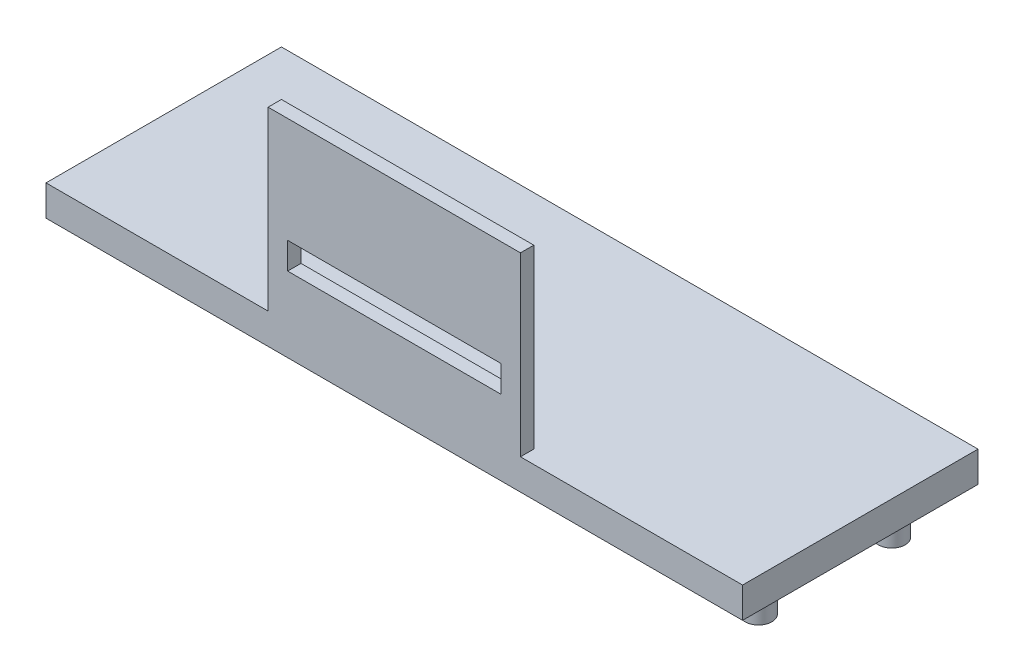
ISO-10303-21;
HEADER;
FILE_DESCRIPTION(('STEP AP214'),'2;1');
FILE_NAME('part.step','',(''),(''),'','','');
FILE_SCHEMA(('AUTOMOTIVE_DESIGN { 1 0 10303 214 1 1 1 1 }'));
ENDSEC;
DATA;
#1=APPLICATION_CONTEXT('core data for automotive mechanical design processes');
#2=APPLICATION_PROTOCOL_DEFINITION('international standard','automotive_design',2000,#1);
#3=PRODUCT_CONTEXT('',#1,'mechanical');
#4=PRODUCT('Part','Part','',(#3));
#5=PRODUCT_RELATED_PRODUCT_CATEGORY('part','',(#4));
#6=PRODUCT_DEFINITION_FORMATION('','',#4);
#7=PRODUCT_DEFINITION_CONTEXT('part definition',#1,'design');
#8=PRODUCT_DEFINITION('design','',#6,#7);
#9=PRODUCT_DEFINITION_SHAPE('','',#8);
#10=(LENGTH_UNIT() NAMED_UNIT(*) SI_UNIT(.MILLI.,.METRE.));
#11=(NAMED_UNIT(*) PLANE_ANGLE_UNIT() SI_UNIT($,.RADIAN.));
#12=(NAMED_UNIT(*) SI_UNIT($,.STERADIAN.) SOLID_ANGLE_UNIT());
#13=UNCERTAINTY_MEASURE_WITH_UNIT(LENGTH_MEASURE(1.E-05),#10,'distance_accuracy_value','');
#14=(GEOMETRIC_REPRESENTATION_CONTEXT(3) GLOBAL_UNCERTAINTY_ASSIGNED_CONTEXT((#13)) GLOBAL_UNIT_ASSIGNED_CONTEXT((#10,
#11,#12)) REPRESENTATION_CONTEXT('',''));
#15=CARTESIAN_POINT('',(0.,0.,0.));
#16=DIRECTION('',(0.,0.,1.));
#17=DIRECTION('',(1.,0.,0.));
#18=AXIS2_PLACEMENT_3D('',#15,#16,#17);
#19=CARTESIAN_POINT('',(0.,0.,0.));
#20=DIRECTION('',(0.,0.,1.));
#21=DIRECTION('',(1.,0.,0.));
#22=AXIS2_PLACEMENT_3D('',#19,#20,#21);
#23=PLANE('',#22);
#24=DIRECTION('',(0.,-1.,0.));
#25=VECTOR('',#24,1.);
#26=CARTESIAN_POINT('',(-30.0255264574549,-8.7836717439894,0.));
#27=LINE('',#26,#25);
#28=CARTESIAN_POINT('',(-30.0255264574549,-8.7836717439894,0.));
#29=VERTEX_POINT('',#28);
#30=CARTESIAN_POINT('',(-30.0255264574549,-14.7836717439894,0.));
#31=VERTEX_POINT('',#30);
#32=EDGE_CURVE('E200',#29,#31,#27,.T.);
#33=ORIENTED_EDGE('',*,*,#32,.F.);
#34=DIRECTION('',(-1.,0.,0.));
#35=VECTOR('',#34,1.);
#36=CARTESIAN_POINT('',(-30.0255264574549,-8.7836717439894,0.));
#37=LINE('',#36,#35);
#38=CARTESIAN_POINT('',(17.9744735425451,-8.7836717439894,0.));
#39=VERTEX_POINT('',#38);
#40=EDGE_CURVE('E213',#39,#29,#37,.T.);
#41=ORIENTED_EDGE('',*,*,#40,.F.);
#42=DIRECTION('',(0.,1.,0.));
#43=VECTOR('',#42,1.);
#44=CARTESIAN_POINT('',(17.9744735425451,-8.7836717439894,0.));
#45=LINE('',#44,#43);
#46=CARTESIAN_POINT('',(17.9744735425451,-14.7836717439894,0.));
#47=VERTEX_POINT('',#46);
#48=EDGE_CURVE('E209',#47,#39,#45,.T.);
#49=ORIENTED_EDGE('',*,*,#48,.F.);
#50=DIRECTION('',(1.,0.,0.));
#51=VECTOR('',#50,1.);
#52=CARTESIAN_POINT('',(-30.0255264574549,-14.7836717439894,0.));
#53=LINE('',#52,#51);
#54=EDGE_CURVE('E205',#31,#47,#53,.T.);
#55=ORIENTED_EDGE('',*,*,#54,.F.);
#56=EDGE_LOOP('',(#33,#41,#49,#55));
#57=FACE_BOUND('',#56,.T.);
#58=DIRECTION('',(0.,1.,0.));
#59=VECTOR('',#58,1.);
#60=CARTESIAN_POINT('',(-84.4294808914688,-31.6728949352056,0.));
#61=LINE('',#60,#59);
#62=CARTESIAN_POINT('',(-84.4294808914688,-31.6728949352056,0.));
#63=VERTEX_POINT('',#62);
#64=CARTESIAN_POINT('',(-84.4294808914688,-24.7836717439894,0.));
#65=VERTEX_POINT('',#64);
#66=EDGE_CURVE('E161',#63,#65,#61,.T.);
#67=ORIENTED_EDGE('',*,*,#66,.F.);
#68=DIRECTION('',(-1.,0.,0.));
#69=VECTOR('',#68,1.);
#70=CARTESIAN_POINT('',(72.3784279765591,-31.6728949352056,0.));
#71=LINE('',#70,#69);
#72=CARTESIAN_POINT('',(72.3784279765591,-31.6728949352056,0.));
#73=VERTEX_POINT('',#72);
#74=EDGE_CURVE('E157',#73,#63,#71,.T.);
#75=ORIENTED_EDGE('',*,*,#74,.F.);
#76=DIRECTION('',(0.,-1.,0.));
#77=VECTOR('',#76,1.);
#78=CARTESIAN_POINT('',(72.3784279765591,-24.7836717439894,0.));
#79=LINE('',#78,#77);
#80=CARTESIAN_POINT('',(72.3784279765591,-24.7836717439894,0.));
#81=VERTEX_POINT('',#80);
#82=EDGE_CURVE('E187',#81,#73,#79,.T.);
#83=ORIENTED_EDGE('',*,*,#82,.F.);
#84=DIRECTION('',(-1.,0.,0.));
#85=VECTOR('',#84,1.);
#86=CARTESIAN_POINT('',(72.3784279765591,-24.7836717439894,0.));
#87=LINE('',#86,#85);
#88=CARTESIAN_POINT('',(22.3784279765591,-24.7836717439894,0.));
#89=VERTEX_POINT('',#88);
#90=EDGE_CURVE('E195',#81,#89,#87,.T.);
#91=ORIENTED_EDGE('',*,*,#90,.T.);
#92=DIRECTION('',(0.,-1.,0.));
#93=VECTOR('',#92,1.);
#94=CARTESIAN_POINT('',(22.3784279765591,14.9757738157678,0.));
#95=LINE('',#94,#93);
#96=CARTESIAN_POINT('',(22.3784279765591,14.9757738157678,0.));
#97=VERTEX_POINT('',#96);
#98=EDGE_CURVE('E261',#97,#89,#95,.T.);
#99=ORIENTED_EDGE('',*,*,#98,.F.);
#100=DIRECTION('',(1.,0.,0.));
#101=VECTOR('',#100,1.);
#102=CARTESIAN_POINT('',(-34.4294808914688,14.9757738157678,0.));
#103=LINE('',#102,#101);
#104=CARTESIAN_POINT('',(-34.4294808914688,14.9757738157678,0.));
#105=VERTEX_POINT('',#104);
#106=EDGE_CURVE('E252',#105,#97,#103,.T.);
#107=ORIENTED_EDGE('',*,*,#106,.F.);
#108=DIRECTION('',(0.,-1.,0.));
#109=VECTOR('',#108,1.);
#110=CARTESIAN_POINT('',(-34.4294808914688,14.9757738157678,0.));
#111=LINE('',#110,#109);
#112=CARTESIAN_POINT('',(-34.4294808914688,-24.7836717439894,0.));
#113=VERTEX_POINT('',#112);
#114=EDGE_CURVE('E246',#105,#113,#111,.T.);
#115=ORIENTED_EDGE('',*,*,#114,.T.);
#116=DIRECTION('',(1.,0.,0.));
#117=VECTOR('',#116,1.);
#118=CARTESIAN_POINT('',(-84.4294808914688,-24.7836717439894,0.));
#119=LINE('',#118,#117);
#120=EDGE_CURVE('E63',#65,#113,#119,.T.);
#121=ORIENTED_EDGE('',*,*,#120,.F.);
#122=EDGE_LOOP('',(#67,#75,#83,#91,#99,#107,#115,#121));
#123=FACE_BOUND('',#122,.T.);
#124=ADVANCED_FACE('F45',(#57,#123),#23,.T.);
#125=CARTESIAN_POINT('',(-34.4294808914688,14.9757738157678,-3.));
#126=DIRECTION('',(-1.,0.,0.));
#127=DIRECTION('',(0.,0.,1.));
#128=AXIS2_PLACEMENT_3D('',#125,#126,#127);
#129=PLANE('',#128);
#130=DIRECTION('',(0.,0.,-1.));
#131=VECTOR('',#130,1.);
#132=CARTESIAN_POINT('',(-34.4294808914688,-24.7836717439894,-53.));
#133=LINE('',#132,#131);
#134=CARTESIAN_POINT('',(-34.4294808914688,-24.7836717439894,-3.));
#135=VERTEX_POINT('',#134);
#136=EDGE_CURVE('E167',#113,#135,#133,.T.);
#137=ORIENTED_EDGE('',*,*,#136,.F.);
#138=ORIENTED_EDGE('',*,*,#114,.F.);
#139=DIRECTION('',(0.,0.,1.));
#140=VECTOR('',#139,1.);
#141=CARTESIAN_POINT('',(-34.4294808914688,14.9757738157678,-3.));
#142=LINE('',#141,#140);
#143=CARTESIAN_POINT('',(-34.4294808914688,14.9757738157678,-3.));
#144=VERTEX_POINT('',#143);
#145=EDGE_CURVE('E55',#144,#105,#142,.T.);
#146=ORIENTED_EDGE('',*,*,#145,.F.);
#147=DIRECTION('',(0.,-1.,0.));
#148=VECTOR('',#147,1.);
#149=CARTESIAN_POINT('',(-34.4294808914688,14.9757738157678,-3.));
#150=LINE('',#149,#148);
#151=EDGE_CURVE('E247',#144,#135,#150,.T.);
#152=ORIENTED_EDGE('',*,*,#151,.T.);
#153=EDGE_LOOP('',(#137,#138,#146,#152));
#154=FACE_BOUND('',#153,.T.);
#155=ADVANCED_FACE('F47',(#154),#129,.T.);
#156=CARTESIAN_POINT('',(22.3784279765591,14.9757738157678,-3.));
#157=DIRECTION('',(-1.,0.,0.));
#158=DIRECTION('',(0.,0.,1.));
#159=AXIS2_PLACEMENT_3D('',#156,#157,#158);
#160=PLANE('',#159);
#161=DIRECTION('',(0.,0.,1.));
#162=VECTOR('',#161,1.);
#163=CARTESIAN_POINT('',(22.3784279765591,-24.7836717439894,-53.));
#164=LINE('',#163,#162);
#165=CARTESIAN_POINT('',(22.3784279765591,-24.7836717439894,-3.));
#166=VERTEX_POINT('',#165);
#167=EDGE_CURVE('E11',#166,#89,#164,.T.);
#168=ORIENTED_EDGE('',*,*,#167,.F.);
#169=DIRECTION('',(0.,-1.,0.));
#170=VECTOR('',#169,1.);
#171=CARTESIAN_POINT('',(22.3784279765591,14.9757738157678,-3.));
#172=LINE('',#171,#170);
#173=CARTESIAN_POINT('',(22.3784279765591,14.9757738157678,-3.));
#174=VERTEX_POINT('',#173);
#175=EDGE_CURVE('E251',#174,#166,#172,.T.);
#176=ORIENTED_EDGE('',*,*,#175,.F.);
#177=DIRECTION('',(0.,0.,1.));
#178=VECTOR('',#177,1.);
#179=CARTESIAN_POINT('',(22.3784279765591,14.9757738157678,-3.));
#180=LINE('',#179,#178);
#181=EDGE_CURVE('E49',#174,#97,#180,.T.);
#182=ORIENTED_EDGE('',*,*,#181,.T.);
#183=ORIENTED_EDGE('',*,*,#98,.T.);
#184=EDGE_LOOP('',(#168,#176,#182,#183));
#185=FACE_BOUND('',#184,.T.);
#186=ADVANCED_FACE('F273',(#185),#160,.F.);
#187=CARTESIAN_POINT('',(-34.4294808914688,14.9757738157678,-3.));
#188=DIRECTION('',(0.,-1.,0.));
#189=DIRECTION('',(0.,0.,-1.));
#190=AXIS2_PLACEMENT_3D('',#187,#188,#189);
#191=PLANE('',#190);
#192=ORIENTED_EDGE('',*,*,#106,.T.);
#193=ORIENTED_EDGE('',*,*,#181,.F.);
#194=DIRECTION('',(1.,0.,0.));
#195=VECTOR('',#194,1.);
#196=CARTESIAN_POINT('',(-34.4294808914688,14.9757738157678,-3.));
#197=LINE('',#196,#195);
#198=EDGE_CURVE('E255',#144,#174,#197,.T.);
#199=ORIENTED_EDGE('',*,*,#198,.F.);
#200=ORIENTED_EDGE('',*,*,#145,.T.);
#201=EDGE_LOOP('',(#192,#193,#199,#200));
#202=FACE_BOUND('',#201,.T.);
#203=ADVANCED_FACE('F285',(#202),#191,.F.);
#204=CARTESIAN_POINT('',(0.,0.,-3.));
#205=DIRECTION('',(0.,0.,1.));
#206=DIRECTION('',(1.,0.,0.));
#207=AXIS2_PLACEMENT_3D('',#204,#205,#206);
#208=PLANE('',#207);
#209=DIRECTION('',(-1.,0.,0.));
#210=VECTOR('',#209,1.);
#211=CARTESIAN_POINT('',(0.,-8.7836717439894,-3.));
#212=LINE('',#211,#210);
#213=CARTESIAN_POINT('',(17.9744735425451,-8.7836717439894,-3.));
#214=VERTEX_POINT('',#213);
#215=CARTESIAN_POINT('',(-30.0255264574549,-8.7836717439894,-3.));
#216=VERTEX_POINT('',#215);
#217=EDGE_CURVE('E238',#214,#216,#212,.T.);
#218=ORIENTED_EDGE('',*,*,#217,.T.);
#219=DIRECTION('',(0.,-1.,0.));
#220=VECTOR('',#219,1.);
#221=CARTESIAN_POINT('',(-30.0255264574549,0.,-3.));
#222=LINE('',#221,#220);
#223=CARTESIAN_POINT('',(-30.0255264574549,-14.7836717439894,-3.));
#224=VERTEX_POINT('',#223);
#225=EDGE_CURVE('E242',#216,#224,#222,.T.);
#226=ORIENTED_EDGE('',*,*,#225,.T.);
#227=DIRECTION('',(1.,0.,0.));
#228=VECTOR('',#227,1.);
#229=CARTESIAN_POINT('',(0.,-14.7836717439894,-3.));
#230=LINE('',#229,#228);
#231=CARTESIAN_POINT('',(17.9744735425451,-14.7836717439894,-3.));
#232=VERTEX_POINT('',#231);
#233=EDGE_CURVE('E221',#224,#232,#230,.T.);
#234=ORIENTED_EDGE('',*,*,#233,.T.);
#235=DIRECTION('',(0.,1.,0.));
#236=VECTOR('',#235,1.);
#237=CARTESIAN_POINT('',(17.9744735425451,0.,-3.));
#238=LINE('',#237,#236);
#239=EDGE_CURVE('E234',#232,#214,#238,.T.);
#240=ORIENTED_EDGE('',*,*,#239,.T.);
#241=EDGE_LOOP('',(#218,#226,#234,#240));
#242=FACE_BOUND('',#241,.T.);
#243=ORIENTED_EDGE('',*,*,#175,.T.);
#244=DIRECTION('',(-1.,0.,0.));
#245=VECTOR('',#244,1.);
#246=CARTESIAN_POINT('',(0.,-24.7836717439894,-3.));
#247=LINE('',#246,#245);
#248=EDGE_CURVE('E151',#166,#135,#247,.T.);
#249=ORIENTED_EDGE('',*,*,#248,.T.);
#250=ORIENTED_EDGE('',*,*,#151,.F.);
#251=ORIENTED_EDGE('',*,*,#198,.T.);
#252=EDGE_LOOP('',(#243,#249,#250,#251));
#253=FACE_BOUND('',#252,.T.);
#254=ADVANCED_FACE('F283',(#242,#253),#208,.F.);
#255=CARTESIAN_POINT('',(-30.0255264574549,-8.7836717439894,-10.));
#256=DIRECTION('',(-1.,0.,0.));
#257=DIRECTION('',(0.,-1.,0.));
#258=AXIS2_PLACEMENT_3D('',#255,#256,#257);
#259=PLANE('',#258);
#260=DIRECTION('',(0.,0.,1.));
#261=VECTOR('',#260,1.);
#262=CARTESIAN_POINT('',(-30.0255264574549,-8.7836717439894,-10.));
#263=LINE('',#262,#261);
#264=EDGE_CURVE('E218',#216,#29,#263,.T.);
#265=ORIENTED_EDGE('',*,*,#264,.T.);
#266=ORIENTED_EDGE('',*,*,#32,.T.);
#267=DIRECTION('',(0.,0.,1.));
#268=VECTOR('',#267,1.);
#269=CARTESIAN_POINT('',(-30.0255264574549,-14.7836717439894,-10.));
#270=LINE('',#269,#268);
#271=EDGE_CURVE('E217',#224,#31,#270,.T.);
#272=ORIENTED_EDGE('',*,*,#271,.F.);
#273=ORIENTED_EDGE('',*,*,#225,.F.);
#274=EDGE_LOOP('',(#265,#266,#272,#273));
#275=FACE_BOUND('',#274,.T.);
#276=ADVANCED_FACE('F292',(#275),#259,.F.);
#277=CARTESIAN_POINT('',(-30.0255264574549,-8.7836717439894,-10.));
#278=DIRECTION('',(0.,1.,0.));
#279=DIRECTION('',(0.,0.,1.));
#280=AXIS2_PLACEMENT_3D('',#277,#278,#279);
#281=PLANE('',#280);
#282=DIRECTION('',(0.,0.,1.));
#283=VECTOR('',#282,1.);
#284=CARTESIAN_POINT('',(17.9744735425451,-8.7836717439894,-10.));
#285=LINE('',#284,#283);
#286=EDGE_CURVE('E222',#214,#39,#285,.T.);
#287=ORIENTED_EDGE('',*,*,#286,.T.);
#288=ORIENTED_EDGE('',*,*,#40,.T.);
#289=ORIENTED_EDGE('',*,*,#264,.F.);
#290=ORIENTED_EDGE('',*,*,#217,.F.);
#291=EDGE_LOOP('',(#287,#288,#289,#290));
#292=FACE_BOUND('',#291,.T.);
#293=ADVANCED_FACE('F305',(#292),#281,.F.);
#294=CARTESIAN_POINT('',(17.9744735425451,-8.7836717439894,-10.));
#295=DIRECTION('',(1.,0.,0.));
#296=DIRECTION('',(0.,1.,0.));
#297=AXIS2_PLACEMENT_3D('',#294,#295,#296);
#298=PLANE('',#297);
#299=DIRECTION('',(0.,0.,1.));
#300=VECTOR('',#299,1.);
#301=CARTESIAN_POINT('',(17.9744735425451,-14.7836717439894,-10.));
#302=LINE('',#301,#300);
#303=EDGE_CURVE('E225',#232,#47,#302,.T.);
#304=ORIENTED_EDGE('',*,*,#303,.T.);
#305=ORIENTED_EDGE('',*,*,#48,.T.);
#306=ORIENTED_EDGE('',*,*,#286,.F.);
#307=ORIENTED_EDGE('',*,*,#239,.F.);
#308=EDGE_LOOP('',(#304,#305,#306,#307));
#309=FACE_BOUND('',#308,.T.);
#310=ADVANCED_FACE('F310',(#309),#298,.F.);
#311=CARTESIAN_POINT('',(-30.0255264574549,-14.7836717439894,-10.));
#312=DIRECTION('',(0.,-1.,0.));
#313=DIRECTION('',(0.,0.,-1.));
#314=AXIS2_PLACEMENT_3D('',#311,#312,#313);
#315=PLANE('',#314);
#316=ORIENTED_EDGE('',*,*,#271,.T.);
#317=ORIENTED_EDGE('',*,*,#54,.T.);
#318=ORIENTED_EDGE('',*,*,#303,.F.);
#319=ORIENTED_EDGE('',*,*,#233,.F.);
#320=EDGE_LOOP('',(#316,#317,#318,#319));
#321=FACE_BOUND('',#320,.T.);
#322=ADVANCED_FACE('F307',(#321),#315,.F.);
#323=CARTESIAN_POINT('',(0.,-31.6728949352056,-53.));
#324=DIRECTION('',(0.,1.,0.));
#325=DIRECTION('',(0.,0.,1.));
#326=AXIS2_PLACEMENT_3D('',#323,#324,#325);
#327=PLANE('',#326);
#328=CARTESIAN_POINT('',(62.9744735425451,-31.6728949352056,-43.));
#329=DIRECTION('',(0.,1.,0.));
#330=DIRECTION('',(0.,0.,1.));
#331=AXIS2_PLACEMENT_3D('',#328,#329,#330);
#332=CIRCLE('',#331,3.00000000000001);
#333=CARTESIAN_POINT('',(62.9744735425451,-31.6728949352056,-40.));
#334=VERTEX_POINT('',#333);
#335=EDGE_CURVE('E370',#334,#334,#332,.T.);
#336=ORIENTED_EDGE('',*,*,#335,.T.);
#337=EDGE_LOOP('',(#336));
#338=FACE_BOUND('',#337,.T.);
#339=CARTESIAN_POINT('',(-75.0255264574549,-31.6728949352056,-13.));
#340=DIRECTION('',(0.,1.,0.));
#341=DIRECTION('',(0.,0.,1.));
#342=AXIS2_PLACEMENT_3D('',#339,#340,#341);
#343=CIRCLE('',#342,3.00000000000001);
#344=CARTESIAN_POINT('',(-75.0255264574549,-31.6728949352056,-10.));
#345=VERTEX_POINT('',#344);
#346=EDGE_CURVE('E377',#345,#345,#343,.T.);
#347=ORIENTED_EDGE('',*,*,#346,.T.);
#348=EDGE_LOOP('',(#347));
#349=FACE_BOUND('',#348,.T.);
#350=CARTESIAN_POINT('',(62.9744735425451,-31.6728949352056,-13.));
#351=DIRECTION('',(0.,1.,0.));
#352=DIRECTION('',(0.,0.,1.));
#353=AXIS2_PLACEMENT_3D('',#350,#351,#352);
#354=CIRCLE('',#353,3.00000000000001);
#355=CARTESIAN_POINT('',(62.9744735425451,-31.6728949352056,-10.));
#356=VERTEX_POINT('',#355);
#357=EDGE_CURVE('E385',#356,#356,#354,.T.);
#358=ORIENTED_EDGE('',*,*,#357,.T.);
#359=EDGE_LOOP('',(#358));
#360=FACE_BOUND('',#359,.T.);
#361=CARTESIAN_POINT('',(-75.0255264574549,-31.6728949352056,-43.));
#362=DIRECTION('',(0.,1.,0.));
#363=DIRECTION('',(0.,0.,1.));
#364=AXIS2_PLACEMENT_3D('',#361,#362,#363);
#365=CIRCLE('',#364,3.00000000000001);
#366=CARTESIAN_POINT('',(-75.0255264574549,-31.6728949352056,-40.));
#367=VERTEX_POINT('',#366);
#368=EDGE_CURVE('E173',#367,#367,#365,.T.);
#369=ORIENTED_EDGE('',*,*,#368,.T.);
#370=EDGE_LOOP('',(#369));
#371=FACE_BOUND('',#370,.T.);
#372=ORIENTED_EDGE('',*,*,#74,.T.);
#373=DIRECTION('',(0.,0.,1.));
#374=VECTOR('',#373,1.);
#375=CARTESIAN_POINT('',(-84.4294808914688,-31.6728949352056,-53.));
#376=LINE('',#375,#374);
#377=CARTESIAN_POINT('',(-84.4294808914688,-31.6728949352056,-53.));
#378=VERTEX_POINT('',#377);
#379=EDGE_CURVE('E154',#378,#63,#376,.T.);
#380=ORIENTED_EDGE('',*,*,#379,.F.);
#381=DIRECTION('',(-1.,0.,0.));
#382=VECTOR('',#381,1.);
#383=CARTESIAN_POINT('',(0.,-31.6728949352056,-53.));
#384=LINE('',#383,#382);
#385=CARTESIAN_POINT('',(72.3784279765591,-31.6728949352056,-53.));
#386=VERTEX_POINT('',#385);
#387=EDGE_CURVE('E139',#386,#378,#384,.T.);
#388=ORIENTED_EDGE('',*,*,#387,.F.);
#389=DIRECTION('',(0.,0.,-1.));
#390=VECTOR('',#389,1.);
#391=CARTESIAN_POINT('',(72.3784279765591,-31.6728949352056,-53.));
#392=LINE('',#391,#390);
#393=EDGE_CURVE('E190',#73,#386,#392,.T.);
#394=ORIENTED_EDGE('',*,*,#393,.F.);
#395=EDGE_LOOP('',(#372,#380,#388,#394));
#396=FACE_BOUND('',#395,.T.);
#397=ADVANCED_FACE('F155',(#338,#349,#360,#371,#396),#327,.F.);
#398=CARTESIAN_POINT('',(0.,-24.7836717439894,-53.));
#399=DIRECTION('',(0.,1.,0.));
#400=DIRECTION('',(0.,0.,1.));
#401=AXIS2_PLACEMENT_3D('',#398,#399,#400);
#402=PLANE('',#401);
#403=ORIENTED_EDGE('',*,*,#248,.F.);
#404=ORIENTED_EDGE('',*,*,#167,.T.);
#405=ORIENTED_EDGE('',*,*,#90,.F.);
#406=DIRECTION('',(0.,0.,1.));
#407=VECTOR('',#406,1.);
#408=CARTESIAN_POINT('',(72.3784279765591,-24.7836717439894,-53.));
#409=LINE('',#408,#407);
#410=CARTESIAN_POINT('',(72.3784279765591,-24.7836717439894,-53.));
#411=VERTEX_POINT('',#410);
#412=EDGE_CURVE('E184',#411,#81,#409,.T.);
#413=ORIENTED_EDGE('',*,*,#412,.F.);
#414=DIRECTION('',(-1.,0.,0.));
#415=VECTOR('',#414,1.);
#416=CARTESIAN_POINT('',(0.,-24.7836717439894,-53.));
#417=LINE('',#416,#415);
#418=CARTESIAN_POINT('',(-84.4294808914688,-24.7836717439894,-53.));
#419=VERTEX_POINT('',#418);
#420=EDGE_CURVE('E150',#411,#419,#417,.T.);
#421=ORIENTED_EDGE('',*,*,#420,.T.);
#422=DIRECTION('',(0.,0.,-1.));
#423=VECTOR('',#422,1.);
#424=CARTESIAN_POINT('',(-84.4294808914688,-24.7836717439894,-53.));
#425=LINE('',#424,#423);
#426=EDGE_CURVE('E165',#65,#419,#425,.T.);
#427=ORIENTED_EDGE('',*,*,#426,.F.);
#428=ORIENTED_EDGE('',*,*,#120,.T.);
#429=ORIENTED_EDGE('',*,*,#136,.T.);
#430=EDGE_LOOP('',(#403,#404,#405,#413,#421,#427,#428,#429));
#431=FACE_BOUND('',#430,.T.);
#432=ADVANCED_FACE('F280',(#431),#402,.T.);
#433=CARTESIAN_POINT('',(0.,0.,-53.));
#434=DIRECTION('',(0.,0.,-1.));
#435=DIRECTION('',(-1.,0.,0.));
#436=AXIS2_PLACEMENT_3D('',#433,#434,#435);
#437=PLANE('',#436);
#438=ORIENTED_EDGE('',*,*,#420,.F.);
#439=DIRECTION('',(0.,1.,0.));
#440=VECTOR('',#439,1.);
#441=CARTESIAN_POINT('',(72.3784279765591,-24.7836717439894,-53.));
#442=LINE('',#441,#440);
#443=EDGE_CURVE('E145',#386,#411,#442,.T.);
#444=ORIENTED_EDGE('',*,*,#443,.F.);
#445=ORIENTED_EDGE('',*,*,#387,.T.);
#446=DIRECTION('',(0.,-1.,0.));
#447=VECTOR('',#446,1.);
#448=CARTESIAN_POINT('',(-84.4294808914688,-31.6728949352056,-53.));
#449=LINE('',#448,#447);
#450=EDGE_CURVE('E143',#419,#378,#449,.T.);
#451=ORIENTED_EDGE('',*,*,#450,.F.);
#452=EDGE_LOOP('',(#438,#444,#445,#451));
#453=FACE_BOUND('',#452,.T.);
#454=ADVANCED_FACE('F141',(#453),#437,.T.);
#455=CARTESIAN_POINT('',(72.3784279765591,0.,0.));
#456=DIRECTION('',(-1.,0.,0.));
#457=DIRECTION('',(0.,0.,1.));
#458=AXIS2_PLACEMENT_3D('',#455,#456,#457);
#459=PLANE('',#458);
#460=ORIENTED_EDGE('',*,*,#443,.T.);
#461=ORIENTED_EDGE('',*,*,#412,.T.);
#462=ORIENTED_EDGE('',*,*,#82,.T.);
#463=ORIENTED_EDGE('',*,*,#393,.T.);
#464=EDGE_LOOP('',(#460,#461,#462,#463));
#465=FACE_BOUND('',#464,.T.);
#466=ADVANCED_FACE('F325',(#465),#459,.F.);
#467=CARTESIAN_POINT('',(-84.4294808914688,0.,0.));
#468=DIRECTION('',(1.,0.,0.));
#469=DIRECTION('',(0.,0.,-1.));
#470=AXIS2_PLACEMENT_3D('',#467,#468,#469);
#471=PLANE('',#470);
#472=ORIENTED_EDGE('',*,*,#450,.T.);
#473=ORIENTED_EDGE('',*,*,#379,.T.);
#474=ORIENTED_EDGE('',*,*,#66,.T.);
#475=ORIENTED_EDGE('',*,*,#426,.T.);
#476=EDGE_LOOP('',(#472,#473,#474,#475));
#477=FACE_BOUND('',#476,.T.);
#478=ADVANCED_FACE('F164',(#477),#471,.F.);
#479=CARTESIAN_POINT('',(-75.0255264574549,-41.6728949352056,-43.));
#480=DIRECTION('',(0.,1.,0.));
#481=DIRECTION('',(0.,0.,1.));
#482=AXIS2_PLACEMENT_3D('',#479,#480,#481);
#483=CYLINDRICAL_SURFACE('',#482,3.00000000000001);
#484=CARTESIAN_POINT('',(-75.0255264574549,-41.6728949352056,-43.));
#485=DIRECTION('',(0.,1.,0.));
#486=DIRECTION('',(0.,0.,1.));
#487=AXIS2_PLACEMENT_3D('',#484,#485,#486);
#488=CIRCLE('',#487,3.00000000000001);
#489=CARTESIAN_POINT('',(-75.0255264574549,-41.6728949352056,-40.));
#490=VERTEX_POINT('',#489);
#491=EDGE_CURVE('E170',#490,#490,#488,.T.);
#492=ORIENTED_EDGE('',*,*,#491,.T.);
#493=EDGE_LOOP('',(#492));
#494=FACE_BOUND('',#493,.T.);
#495=ORIENTED_EDGE('',*,*,#368,.F.);
#496=EDGE_LOOP('',(#495));
#497=FACE_BOUND('',#496,.T.);
#498=ADVANCED_FACE('F331',(#494,#497),#483,.T.);
#499=CARTESIAN_POINT('',(-75.0255264574549,-41.6728949352056,-43.));
#500=DIRECTION('',(0.,1.,0.));
#501=DIRECTION('',(0.,0.,1.));
#502=AXIS2_PLACEMENT_3D('',#499,#500,#501);
#503=PLANE('',#502);
#504=ORIENTED_EDGE('',*,*,#491,.F.);
#505=EDGE_LOOP('',(#504));
#506=FACE_BOUND('',#505,.T.);
#507=ADVANCED_FACE('F334',(#506),#503,.F.);
#508=CARTESIAN_POINT('',(62.9744735425451,-41.6728949352056,-13.));
#509=DIRECTION('',(0.,1.,0.));
#510=DIRECTION('',(0.,0.,1.));
#511=AXIS2_PLACEMENT_3D('',#508,#509,#510);
#512=CYLINDRICAL_SURFACE('',#511,3.00000000000001);
#513=CARTESIAN_POINT('',(62.9744735425451,-41.6728949352056,-13.));
#514=DIRECTION('',(0.,1.,0.));
#515=DIRECTION('',(0.,0.,1.));
#516=AXIS2_PLACEMENT_3D('',#513,#514,#515);
#517=CIRCLE('',#516,3.00000000000001);
#518=CARTESIAN_POINT('',(62.9744735425451,-41.6728949352056,-10.));
#519=VERTEX_POINT('',#518);
#520=EDGE_CURVE('E383',#519,#519,#517,.T.);
#521=ORIENTED_EDGE('',*,*,#520,.T.);
#522=EDGE_LOOP('',(#521));
#523=FACE_BOUND('',#522,.T.);
#524=ORIENTED_EDGE('',*,*,#357,.F.);
#525=EDGE_LOOP('',(#524));
#526=FACE_BOUND('',#525,.T.);
#527=ADVANCED_FACE('F338',(#523,#526),#512,.T.);
#528=CARTESIAN_POINT('',(62.9744735425451,-41.6728949352056,-13.));
#529=DIRECTION('',(0.,1.,0.));
#530=DIRECTION('',(0.,0.,1.));
#531=AXIS2_PLACEMENT_3D('',#528,#529,#530);
#532=PLANE('',#531);
#533=ORIENTED_EDGE('',*,*,#520,.F.);
#534=EDGE_LOOP('',(#533));
#535=FACE_BOUND('',#534,.T.);
#536=ADVANCED_FACE('F340',(#535),#532,.F.);
#537=CARTESIAN_POINT('',(-75.0255264574549,-41.6728949352056,-13.));
#538=DIRECTION('',(0.,1.,0.));
#539=DIRECTION('',(0.,0.,1.));
#540=AXIS2_PLACEMENT_3D('',#537,#538,#539);
#541=CYLINDRICAL_SURFACE('',#540,3.00000000000001);
#542=CARTESIAN_POINT('',(-75.0255264574549,-41.6728949352056,-13.));
#543=DIRECTION('',(0.,1.,0.));
#544=DIRECTION('',(0.,0.,1.));
#545=AXIS2_PLACEMENT_3D('',#542,#543,#544);
#546=CIRCLE('',#545,3.00000000000001);
#547=CARTESIAN_POINT('',(-75.0255264574549,-41.6728949352056,-10.));
#548=VERTEX_POINT('',#547);
#549=EDGE_CURVE('E372',#548,#548,#546,.T.);
#550=ORIENTED_EDGE('',*,*,#549,.T.);
#551=EDGE_LOOP('',(#550));
#552=FACE_BOUND('',#551,.T.);
#553=ORIENTED_EDGE('',*,*,#346,.F.);
#554=EDGE_LOOP('',(#553));
#555=FACE_BOUND('',#554,.T.);
#556=ADVANCED_FACE('F343',(#552,#555),#541,.T.);
#557=CARTESIAN_POINT('',(-75.0255264574549,-41.6728949352056,-13.));
#558=DIRECTION('',(0.,1.,0.));
#559=DIRECTION('',(0.,0.,1.));
#560=AXIS2_PLACEMENT_3D('',#557,#558,#559);
#561=PLANE('',#560);
#562=ORIENTED_EDGE('',*,*,#549,.F.);
#563=EDGE_LOOP('',(#562));
#564=FACE_BOUND('',#563,.T.);
#565=ADVANCED_FACE('F348',(#564),#561,.F.);
#566=CARTESIAN_POINT('',(62.9744735425451,-41.6728949352056,-43.));
#567=DIRECTION('',(0.,1.,0.));
#568=DIRECTION('',(0.,0.,1.));
#569=AXIS2_PLACEMENT_3D('',#566,#567,#568);
#570=CYLINDRICAL_SURFACE('',#569,3.00000000000001);
#571=CARTESIAN_POINT('',(62.9744735425451,-41.6728949352056,-43.));
#572=DIRECTION('',(0.,1.,0.));
#573=DIRECTION('',(0.,0.,1.));
#574=AXIS2_PLACEMENT_3D('',#571,#572,#573);
#575=CIRCLE('',#574,3.00000000000001);
#576=CARTESIAN_POINT('',(62.9744735425451,-41.6728949352056,-40.));
#577=VERTEX_POINT('',#576);
#578=EDGE_CURVE('E367',#577,#577,#575,.T.);
#579=ORIENTED_EDGE('',*,*,#578,.T.);
#580=EDGE_LOOP('',(#579));
#581=FACE_BOUND('',#580,.T.);
#582=ORIENTED_EDGE('',*,*,#335,.F.);
#583=EDGE_LOOP('',(#582));
#584=FACE_BOUND('',#583,.T.);
#585=ADVANCED_FACE('F351',(#581,#584),#570,.T.);
#586=CARTESIAN_POINT('',(62.9744735425451,-41.6728949352056,-43.));
#587=DIRECTION('',(0.,1.,0.));
#588=DIRECTION('',(0.,0.,1.));
#589=AXIS2_PLACEMENT_3D('',#586,#587,#588);
#590=PLANE('',#589);
#591=ORIENTED_EDGE('',*,*,#578,.F.);
#592=EDGE_LOOP('',(#591));
#593=FACE_BOUND('',#592,.T.);
#594=ADVANCED_FACE('F356',(#593),#590,.F.);
#595=CLOSED_SHELL('',(#124,#155,#186,#203,#254,#276,#293,#310,#322,#397,#432,#454,#466,#478,
#498,#507,#527,#536,#556,#565,#585,#594));
#596=MANIFOLD_SOLID_BREP('B2',#595);
#597=ADVANCED_BREP_SHAPE_REPRESENTATION('',(#18,#596),#14);
#598=SHAPE_DEFINITION_REPRESENTATION(#9,#597);
ENDSEC;
END-ISO-10303-21;
